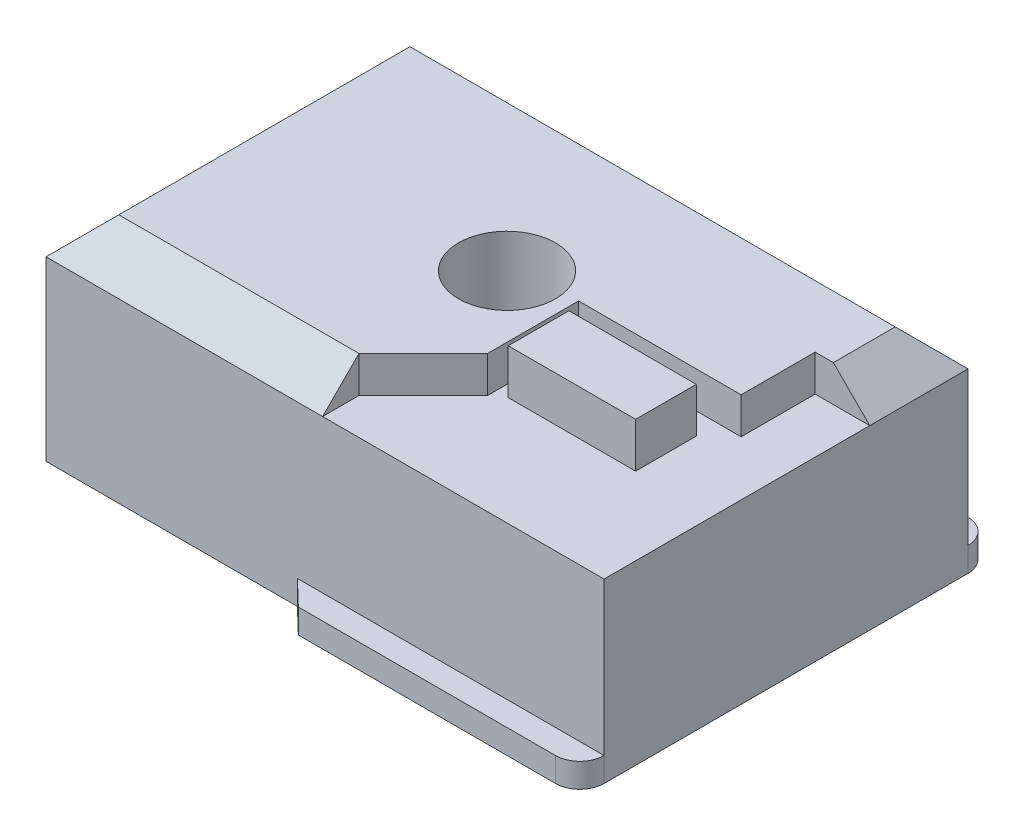
ISO-10303-21;
HEADER;
FILE_DESCRIPTION(('STEP AP214'),'2;1');
FILE_NAME('part.step','',(''),(''),'','','');
FILE_SCHEMA(('AUTOMOTIVE_DESIGN { 1 0 10303 214 1 1 1 1 }'));
ENDSEC;
DATA;
#1=APPLICATION_CONTEXT('core data for automotive mechanical design processes');
#2=APPLICATION_PROTOCOL_DEFINITION('international standard','automotive_design',2000,#1);
#3=PRODUCT_CONTEXT('',#1,'mechanical');
#4=PRODUCT('Part','Part','',(#3));
#5=PRODUCT_RELATED_PRODUCT_CATEGORY('part','',(#4));
#6=PRODUCT_DEFINITION_FORMATION('','',#4);
#7=PRODUCT_DEFINITION_CONTEXT('part definition',#1,'design');
#8=PRODUCT_DEFINITION('design','',#6,#7);
#9=PRODUCT_DEFINITION_SHAPE('','',#8);
#10=(LENGTH_UNIT() NAMED_UNIT(*) SI_UNIT(.MILLI.,.METRE.));
#11=(NAMED_UNIT(*) PLANE_ANGLE_UNIT() SI_UNIT($,.RADIAN.));
#12=(NAMED_UNIT(*) SI_UNIT($,.STERADIAN.) SOLID_ANGLE_UNIT());
#13=UNCERTAINTY_MEASURE_WITH_UNIT(LENGTH_MEASURE(1.E-05),#10,'distance_accuracy_value','');
#14=(GEOMETRIC_REPRESENTATION_CONTEXT(3) GLOBAL_UNCERTAINTY_ASSIGNED_CONTEXT((#13)) GLOBAL_UNIT_ASSIGNED_CONTEXT((#10,
#11,#12)) REPRESENTATION_CONTEXT('',''));
#15=CARTESIAN_POINT('',(0.,0.,0.));
#16=DIRECTION('',(0.,0.,1.));
#17=DIRECTION('',(1.,0.,0.));
#18=AXIS2_PLACEMENT_3D('',#15,#16,#17);
#19=CARTESIAN_POINT('',(0.,18.3,6.));
#20=DIRECTION('',(0.,0.,1.));
#21=DIRECTION('',(1.,0.,0.));
#22=AXIS2_PLACEMENT_3D('',#19,#20,#21);
#23=PLANE('',#22);
#24=DIRECTION('',(-1.,0.,0.));
#25=VECTOR('',#24,1.);
#26=CARTESIAN_POINT('',(0.,14.6,6.));
#27=LINE('',#26,#25);
#28=CARTESIAN_POINT('',(16.6,14.6,6.));
#29=VERTEX_POINT('',#28);
#30=CARTESIAN_POINT('',(6.1,14.6,6.));
#31=VERTEX_POINT('',#30);
#32=EDGE_CURVE('E112',#29,#31,#27,.T.);
#33=ORIENTED_EDGE('',*,*,#32,.F.);
#34=DIRECTION('',(0.,-1.,0.));
#35=VECTOR('',#34,1.);
#36=CARTESIAN_POINT('',(16.6,18.3,6.));
#37=LINE('',#36,#35);
#38=CARTESIAN_POINT('',(16.6,18.3,6.));
#39=VERTEX_POINT('',#38);
#40=EDGE_CURVE('E12',#39,#29,#37,.T.);
#41=ORIENTED_EDGE('',*,*,#40,.F.);
#42=DIRECTION('',(-1.,0.,0.));
#43=VECTOR('',#42,1.);
#44=CARTESIAN_POINT('',(0.,18.3,6.));
#45=LINE('',#44,#43);
#46=CARTESIAN_POINT('',(6.1,18.3,6.));
#47=VERTEX_POINT('',#46);
#48=EDGE_CURVE('E106',#39,#47,#45,.T.);
#49=ORIENTED_EDGE('',*,*,#48,.T.);
#50=DIRECTION('',(0.,-1.,0.));
#51=VECTOR('',#50,1.);
#52=CARTESIAN_POINT('',(6.1,18.3,6.));
#53=LINE('',#52,#51);
#54=EDGE_CURVE('E51',#47,#31,#53,.T.);
#55=ORIENTED_EDGE('',*,*,#54,.T.);
#56=EDGE_LOOP('',(#33,#41,#49,#55));
#57=FACE_BOUND('',#56,.T.);
#58=ADVANCED_FACE('F48',(#57),#23,.T.);
#59=CARTESIAN_POINT('',(16.6,18.3,0.));
#60=DIRECTION('',(1.,0.,0.));
#61=DIRECTION('',(0.,0.,-1.));
#62=AXIS2_PLACEMENT_3D('',#59,#60,#61);
#63=PLANE('',#62);
#64=DIRECTION('',(0.,0.,1.));
#65=VECTOR('',#64,1.);
#66=CARTESIAN_POINT('',(16.6,14.6,0.));
#67=LINE('',#66,#65);
#68=CARTESIAN_POINT('',(16.6,14.6,1.));
#69=VERTEX_POINT('',#68);
#70=EDGE_CURVE('E108',#69,#29,#67,.T.);
#71=ORIENTED_EDGE('',*,*,#70,.F.);
#72=DIRECTION('',(0.,-1.,0.));
#73=VECTOR('',#72,1.);
#74=CARTESIAN_POINT('',(16.6,18.3,1.));
#75=LINE('',#74,#73);
#76=CARTESIAN_POINT('',(16.6,18.3,1.));
#77=VERTEX_POINT('',#76);
#78=EDGE_CURVE('E57',#77,#69,#75,.T.);
#79=ORIENTED_EDGE('',*,*,#78,.F.);
#80=DIRECTION('',(0.,0.,1.));
#81=VECTOR('',#80,1.);
#82=CARTESIAN_POINT('',(16.6,18.3,0.));
#83=LINE('',#82,#81);
#84=EDGE_CURVE('E103',#77,#39,#83,.T.);
#85=ORIENTED_EDGE('',*,*,#84,.T.);
#86=ORIENTED_EDGE('',*,*,#40,.T.);
#87=EDGE_LOOP('',(#71,#79,#85,#86));
#88=FACE_BOUND('',#87,.T.);
#89=ADVANCED_FACE('F122',(#88),#63,.T.);
#90=CARTESIAN_POINT('',(0.,18.3,1.));
#91=DIRECTION('',(0.,0.,-1.));
#92=DIRECTION('',(-1.,0.,0.));
#93=AXIS2_PLACEMENT_3D('',#90,#91,#92);
#94=PLANE('',#93);
#95=DIRECTION('',(1.,0.,0.));
#96=VECTOR('',#95,1.);
#97=CARTESIAN_POINT('',(0.,14.6,1.));
#98=LINE('',#97,#96);
#99=CARTESIAN_POINT('',(6.1,14.6,1.));
#100=VERTEX_POINT('',#99);
#101=EDGE_CURVE('E98',#100,#69,#98,.T.);
#102=ORIENTED_EDGE('',*,*,#101,.F.);
#103=DIRECTION('',(0.,-1.,0.));
#104=VECTOR('',#103,1.);
#105=CARTESIAN_POINT('',(6.1,18.3,1.));
#106=LINE('',#105,#104);
#107=CARTESIAN_POINT('',(6.1,18.3,1.));
#108=VERTEX_POINT('',#107);
#109=EDGE_CURVE('E93',#108,#100,#106,.T.);
#110=ORIENTED_EDGE('',*,*,#109,.F.);
#111=DIRECTION('',(1.,0.,0.));
#112=VECTOR('',#111,1.);
#113=CARTESIAN_POINT('',(0.,18.3,1.));
#114=LINE('',#113,#112);
#115=EDGE_CURVE('E96',#108,#77,#114,.T.);
#116=ORIENTED_EDGE('',*,*,#115,.T.);
#117=ORIENTED_EDGE('',*,*,#78,.T.);
#118=EDGE_LOOP('',(#102,#110,#116,#117));
#119=FACE_BOUND('',#118,.T.);
#120=ADVANCED_FACE('F95',(#119),#94,.T.);
#121=CARTESIAN_POINT('',(6.1,18.3,0.));
#122=DIRECTION('',(-1.,0.,0.));
#123=DIRECTION('',(0.,0.,1.));
#124=AXIS2_PLACEMENT_3D('',#121,#122,#123);
#125=PLANE('',#124);
#126=DIRECTION('',(0.,0.,-1.));
#127=VECTOR('',#126,1.);
#128=CARTESIAN_POINT('',(6.1,14.6,0.));
#129=LINE('',#128,#127);
#130=EDGE_CURVE('E115',#31,#100,#129,.T.);
#131=ORIENTED_EDGE('',*,*,#130,.F.);
#132=ORIENTED_EDGE('',*,*,#54,.F.);
#133=DIRECTION('',(0.,0.,-1.));
#134=VECTOR('',#133,1.);
#135=CARTESIAN_POINT('',(6.1,18.3,0.));
#136=LINE('',#135,#134);
#137=EDGE_CURVE('E102',#47,#108,#136,.T.);
#138=ORIENTED_EDGE('',*,*,#137,.T.);
#139=ORIENTED_EDGE('',*,*,#109,.T.);
#140=EDGE_LOOP('',(#131,#132,#138,#139));
#141=FACE_BOUND('',#140,.T.);
#142=ADVANCED_FACE('F105',(#141),#125,.T.);
#143=CARTESIAN_POINT('',(0.,18.3,0.));
#144=DIRECTION('',(0.,-1.,0.));
#145=DIRECTION('',(0.,0.,-1.));
#146=AXIS2_PLACEMENT_3D('',#143,#144,#145);
#147=PLANE('',#146);
#148=ORIENTED_EDGE('',*,*,#48,.F.);
#149=ORIENTED_EDGE('',*,*,#84,.F.);
#150=ORIENTED_EDGE('',*,*,#115,.F.);
#151=ORIENTED_EDGE('',*,*,#137,.F.);
#152=EDGE_LOOP('',(#148,#149,#150,#151));
#153=FACE_BOUND('',#152,.T.);
#154=ADVANCED_FACE('F101',(#153),#147,.F.);
#155=CARTESIAN_POINT('',(0.,14.6,0.));
#156=DIRECTION('',(0.,-1.,0.));
#157=DIRECTION('',(0.,0.,-1.));
#158=AXIS2_PLACEMENT_3D('',#155,#156,#157);
#159=PLANE('',#158);
#160=ORIENTED_EDGE('',*,*,#32,.T.);
#161=ORIENTED_EDGE('',*,*,#130,.T.);
#162=ORIENTED_EDGE('',*,*,#101,.T.);
#163=ORIENTED_EDGE('',*,*,#70,.T.);
#164=EDGE_LOOP('',(#160,#161,#162,#163));
#165=FACE_BOUND('',#164,.T.);
#166=ADVANCED_FACE('F121',(#165),#159,.T.);
#167=CLOSED_SHELL('',(#58,#89,#120,#142,#154,#166));
#168=MANIFOLD_SOLID_BREP('B2',#167);
#169=CARTESIAN_POINT('',(0.,17.6000000000012,0.));
#170=DIRECTION('',(0.,1.00000000000005,0.));
#171=DIRECTION('',(0.,0.,1.00000000000005));
#172=AXIS2_PLACEMENT_3D('',#169,#170,#171);
#173=PLANE('',#172);
#174=CARTESIAN_POINT('',(0.,17.6000000000012,0.));
#175=DIRECTION('',(0.,1.00000000000005,0.));
#176=DIRECTION('',(0.,0.,1.00000000000005));
#177=AXIS2_PLACEMENT_3D('',#174,#175,#176);
#178=CIRCLE('',#177,4.);
#179=CARTESIAN_POINT('',(0.,17.6000000000012,4.0000000000002));
#180=VERTEX_POINT('',#179);
#181=EDGE_CURVE('E336',#180,#180,#178,.T.);
#182=ORIENTED_EDGE('',*,*,#181,.F.);
#183=EDGE_LOOP('',(#182));
#184=FACE_BOUND('',#183,.T.);
#185=DIRECTION('',(1.,0.,0.));
#186=VECTOR('',#185,1.);
#187=CARTESIAN_POINT('',(-20.,17.6000000000012,12.0000000000015));
#188=LINE('',#187,#186);
#189=CARTESIAN_POINT('',(-20.,17.6000000000012,12.0000000000015));
#190=VERTEX_POINT('',#189);
#191=CARTESIAN_POINT('',(-0.199999999999992,17.6000000000012,12.0000000000015));
#192=VERTEX_POINT('',#191);
#193=EDGE_CURVE('E348',#190,#192,#188,.T.);
#194=ORIENTED_EDGE('',*,*,#193,.T.);
#195=DIRECTION('',(0.707106781186546,0.,-0.707106781186574));
#196=VECTOR('',#195,1.);
#197=CARTESIAN_POINT('',(5.9,17.6000000000012,5.89999999999998));
#198=LINE('',#197,#196);
#199=CARTESIAN_POINT('',(5.1,17.6000000000012,6.69999999999998));
#200=VERTEX_POINT('',#199);
#201=EDGE_CURVE('E520',#192,#200,#198,.T.);
#202=ORIENTED_EDGE('',*,*,#201,.T.);
#203=DIRECTION('',(0.,0.,-1.00000000000005));
#204=VECTOR('',#203,1.);
#205=CARTESIAN_POINT('',(5.1,17.6000000000012,0.));
#206=LINE('',#205,#204);
#207=CARTESIAN_POINT('',(5.1,17.6000000000012,-0.800000000000002));
#208=VERTEX_POINT('',#207);
#209=EDGE_CURVE('E319',#200,#208,#206,.T.);
#210=ORIENTED_EDGE('',*,*,#209,.T.);
#211=DIRECTION('',(1.,0.,0.));
#212=VECTOR('',#211,1.);
#213=CARTESIAN_POINT('',(0.,17.6000000000012,-0.800000000000002));
#214=LINE('',#213,#212);
#215=CARTESIAN_POINT('',(18.5,17.6000000000012,-0.800000000000002));
#216=VERTEX_POINT('',#215);
#217=EDGE_CURVE('E508',#208,#216,#214,.T.);
#218=ORIENTED_EDGE('',*,*,#217,.T.);
#219=DIRECTION('',(0.,0.,-1.00000000000005));
#220=VECTOR('',#219,1.);
#221=CARTESIAN_POINT('',(18.5,17.6000000000012,0.));
#222=LINE('',#221,#220);
#223=CARTESIAN_POINT('',(18.5,17.6000000000012,-6.9));
#224=VERTEX_POINT('',#223);
#225=EDGE_CURVE('E506',#216,#224,#222,.T.);
#226=ORIENTED_EDGE('',*,*,#225,.T.);
#227=DIRECTION('',(1.,0.,0.));
#228=VECTOR('',#227,1.);
#229=CARTESIAN_POINT('',(0.,17.6000000000012,-6.9));
#230=LINE('',#229,#228);
#231=CARTESIAN_POINT('',(20.,17.6000000000012,-6.9));
#232=VERTEX_POINT('',#231);
#233=EDGE_CURVE('E315',#224,#232,#230,.T.);
#234=ORIENTED_EDGE('',*,*,#233,.T.);
#235=DIRECTION('',(0.,0.,-1.00000000000005));
#236=VECTOR('',#235,1.);
#237=CARTESIAN_POINT('',(20.,17.6000000000012,-12.0000000000004));
#238=LINE('',#237,#236);
#239=CARTESIAN_POINT('',(20.,17.6000000000012,-12.0000000000004));
#240=VERTEX_POINT('',#239);
#241=EDGE_CURVE('E339',#232,#240,#238,.T.);
#242=ORIENTED_EDGE('',*,*,#241,.T.);
#243=DIRECTION('',(-1.,0.,0.));
#244=VECTOR('',#243,1.);
#245=CARTESIAN_POINT('',(-20.,17.6000000000012,-12.0000000000004));
#246=LINE('',#245,#244);
#247=CARTESIAN_POINT('',(-20.,17.6000000000012,-12.0000000000004));
#248=VERTEX_POINT('',#247);
#249=EDGE_CURVE('E343',#240,#248,#246,.T.);
#250=ORIENTED_EDGE('',*,*,#249,.T.);
#251=DIRECTION('',(0.,0.,1.00000000000005));
#252=VECTOR('',#251,1.);
#253=CARTESIAN_POINT('',(-20.,17.6000000000012,-12.0000000000004));
#254=LINE('',#253,#252);
#255=EDGE_CURVE('E346',#248,#190,#254,.T.);
#256=ORIENTED_EDGE('',*,*,#255,.T.);
#257=EDGE_LOOP('',(#194,#202,#210,#218,#226,#234,#242,#250,#256));
#258=FACE_BOUND('',#257,.T.);
#259=ADVANCED_FACE('F171',(#184,#258),#173,.T.);
#260=CARTESIAN_POINT('',(0.,37.6000000000023,-16.2426406871201));
#261=DIRECTION('',(0.707106781186548,0.707106781186572,0.));
#262=DIRECTION('',(-0.707106781186547,0.707106781186572,0.));
#263=AXIS2_PLACEMENT_3D('',#260,#261,#262);
#264=PLANE('',#263);
#265=ORIENTED_EDGE('',*,*,#241,.F.);
#266=DIRECTION('',(0.707106781186547,-0.707106781186572,0.));
#267=VECTOR('',#266,1.);
#268=CARTESIAN_POINT('',(0.,37.6000000000023,-6.9));
#269=LINE('',#268,#267);
#270=CARTESIAN_POINT('',(23.,14.6000000000015,-6.9));
#271=VERTEX_POINT('',#270);
#272=EDGE_CURVE('E46',#232,#271,#269,.T.);
#273=ORIENTED_EDGE('',*,*,#272,.T.);
#274=DIRECTION('',(0.,0.,-1.00000000000005));
#275=VECTOR('',#274,1.);
#276=CARTESIAN_POINT('',(23.,14.6000000000015,15.0000000000015));
#277=LINE('',#276,#275);
#278=CARTESIAN_POINT('',(23.,14.6000000000015,-15.0000000000008));
#279=VERTEX_POINT('',#278);
#280=EDGE_CURVE('E357',#271,#279,#277,.T.);
#281=ORIENTED_EDGE('',*,*,#280,.T.);
#282=DIRECTION('',(0.577350269189626,-0.577350269189651,-0.577350269189651));
#283=VECTOR('',#282,1.);
#284=CARTESIAN_POINT('',(8.08088022903977,29.5191197709622,-0.0808802290397717));
#285=LINE('',#284,#283);
#286=EDGE_CURVE('E324',#240,#279,#285,.T.);
#287=ORIENTED_EDGE('',*,*,#286,.F.);
#288=EDGE_LOOP('',(#265,#273,#281,#287));
#289=FACE_BOUND('',#288,.T.);
#290=ADVANCED_FACE('F496',(#289),#264,.T.);
#291=CARTESIAN_POINT('',(-52.0198577212881,40.3475468957087,-10.7475468957065));
#292=DIRECTION('',(0.,-0.707106781186573,-0.707106781186571));
#293=DIRECTION('',(0.,0.707106781186571,-0.707106781186573));
#294=AXIS2_PLACEMENT_3D('',#291,#292,#293);
#295=PLANE('',#294);
#296=DIRECTION('',(0.,-0.707106781186571,0.707106781186573));
#297=VECTOR('',#296,1.);
#298=CARTESIAN_POINT('',(-0.199999999999992,40.3475468957087,-10.7475468957065));
#299=LINE('',#298,#297);
#300=CARTESIAN_POINT('',(-0.199999999999992,14.6000000000015,15.0000000000015));
#301=VERTEX_POINT('',#300);
#302=EDGE_CURVE('E179',#192,#301,#299,.T.);
#303=ORIENTED_EDGE('',*,*,#302,.F.);
#304=ORIENTED_EDGE('',*,*,#193,.F.);
#305=DIRECTION('',(0.577350269189625,0.57735026918965,-0.577350269189652));
#306=VECTOR('',#305,1.);
#307=CARTESIAN_POINT('',(-15.5082546432917,22.0917453567094,7.50825464329169));
#308=LINE('',#307,#306);
#309=CARTESIAN_POINT('',(-23.,14.6000000000015,15.0000000000015));
#310=VERTEX_POINT('',#309);
#311=EDGE_CURVE('E320',#310,#190,#308,.T.);
#312=ORIENTED_EDGE('',*,*,#311,.F.);
#313=DIRECTION('',(1.,0.,0.));
#314=VECTOR('',#313,1.);
#315=CARTESIAN_POINT('',(-23.,14.6000000000015,15.0000000000015));
#316=LINE('',#315,#314);
#317=EDGE_CURVE('E354',#310,#301,#316,.T.);
#318=ORIENTED_EDGE('',*,*,#317,.T.);
#319=EDGE_LOOP('',(#303,#304,#312,#318));
#320=FACE_BOUND('',#319,.T.);
#321=ADVANCED_FACE('F450',(#320),#295,.F.);
#322=CARTESIAN_POINT('',(-21.,2.00000000000077,-15.0000000000008));
#323=DIRECTION('',(0.,1.00000000000005,0.));
#324=DIRECTION('',(0.,0.,1.00000000000005));
#325=AXIS2_PLACEMENT_3D('',#322,#323,#324);
#326=PLANE('',#325);
#327=CARTESIAN_POINT('',(21.,2.00000000000077,15.0000000000015));
#328=DIRECTION('',(0.,1.00000000000005,0.));
#329=DIRECTION('',(0.,0.,1.00000000000005));
#330=AXIS2_PLACEMENT_3D('',#327,#328,#329);
#331=CIRCLE('',#330,2.);
#332=CARTESIAN_POINT('',(21.,2.00000000000077,17.0000000000015));
#333=VERTEX_POINT('',#332);
#334=CARTESIAN_POINT('',(23.,2.00000000000077,15.0000000000015));
#335=VERTEX_POINT('',#334);
#336=EDGE_CURVE('E392',#333,#335,#331,.T.);
#337=ORIENTED_EDGE('',*,*,#336,.T.);
#338=DIRECTION('',(-1.,0.,0.));
#339=VECTOR('',#338,1.);
#340=CARTESIAN_POINT('',(-21.,2.00000000000077,15.0000000000015));
#341=LINE('',#340,#339);
#342=CARTESIAN_POINT('',(-2.27407407407407,2.00000000000077,15.0000000000015));
#343=VERTEX_POINT('',#342);
#344=EDGE_CURVE('E381',#335,#343,#341,.T.);
#345=ORIENTED_EDGE('',*,*,#344,.T.);
#346=DIRECTION('',(0.719844295420686,0.,0.694135570584256));
#347=VECTOR('',#346,1.);
#348=CARTESIAN_POINT('',(-3.,2.00000000000077,14.3000000000015));
#349=LINE('',#348,#347);
#350=CARTESIAN_POINT('',(-0.199999999999999,2.00000000000077,17.0000000000015));
#351=VERTEX_POINT('',#350);
#352=EDGE_CURVE('E387',#343,#351,#349,.T.);
#353=ORIENTED_EDGE('',*,*,#352,.T.);
#354=DIRECTION('',(1.,0.,0.));
#355=VECTOR('',#354,1.);
#356=CARTESIAN_POINT('',(21.,2.00000000000077,17.0000000000015));
#357=LINE('',#356,#355);
#358=EDGE_CURVE('E390',#351,#333,#357,.T.);
#359=ORIENTED_EDGE('',*,*,#358,.T.);
#360=EDGE_LOOP('',(#337,#345,#353,#359));
#361=FACE_BOUND('',#360,.T.);
#362=ADVANCED_FACE('F552',(#361),#326,.T.);
#363=CARTESIAN_POINT('',(-21.,2.00000000000077,-15.0000000000008));
#364=DIRECTION('',(0.,1.00000000000005,0.));
#365=DIRECTION('',(0.,0.,1.00000000000005));
#366=AXIS2_PLACEMENT_3D('',#363,#364,#365);
#367=CIRCLE('',#366,2.);
#368=CARTESIAN_POINT('',(-21.,2.00000000000077,-17.0000000000008));
#369=VERTEX_POINT('',#368);
#370=CARTESIAN_POINT('',(-23.,2.00000000000077,-15.0000000000008));
#371=VERTEX_POINT('',#370);
#372=EDGE_CURVE('E385',#369,#371,#367,.T.);
#373=ORIENTED_EDGE('',*,*,#372,.T.);
#374=DIRECTION('',(1.,0.,0.));
#375=VECTOR('',#374,1.);
#376=CARTESIAN_POINT('',(-21.,2.00000000000077,-15.0000000000008));
#377=LINE('',#376,#375);
#378=CARTESIAN_POINT('',(23.,2.00000000000077,-15.0000000000008));
#379=VERTEX_POINT('',#378);
#380=EDGE_CURVE('E378',#371,#379,#377,.T.);
#381=ORIENTED_EDGE('',*,*,#380,.T.);
#382=CARTESIAN_POINT('',(21.,2.00000000000077,-15.0000000000008));
#383=DIRECTION('',(0.,1.00000000000005,0.));
#384=DIRECTION('',(0.,0.,1.00000000000005));
#385=AXIS2_PLACEMENT_3D('',#382,#383,#384);
#386=CIRCLE('',#385,2.);
#387=CARTESIAN_POINT('',(21.,2.00000000000077,-17.0000000000008));
#388=VERTEX_POINT('',#387);
#389=EDGE_CURVE('E394',#379,#388,#386,.T.);
#390=ORIENTED_EDGE('',*,*,#389,.T.);
#391=DIRECTION('',(-1.,0.,0.));
#392=VECTOR('',#391,1.);
#393=CARTESIAN_POINT('',(-21.,2.00000000000077,-17.0000000000008));
#394=LINE('',#393,#392);
#395=EDGE_CURVE('E396',#388,#369,#394,.T.);
#396=ORIENTED_EDGE('',*,*,#395,.T.);
#397=EDGE_LOOP('',(#373,#381,#390,#396));
#398=FACE_BOUND('',#397,.T.);
#399=ADVANCED_FACE('F468',(#398),#326,.T.);
#400=CARTESIAN_POINT('',(-3.,2.00000000000077,14.3000000000015));
#401=DIRECTION('',(0.694135570584232,0.,-0.71984429542071));
#402=DIRECTION('',(-0.719844295420686,0.,-0.694135570584256));
#403=AXIS2_PLACEMENT_3D('',#400,#401,#402);
#404=PLANE('',#403);
#405=DIRECTION('',(0.,1.00000000000005,0.));
#406=VECTOR('',#405,1.);
#407=CARTESIAN_POINT('',(-2.27407407407407,2.00000000000077,15.0000000000015));
#408=LINE('',#407,#406);
#409=CARTESIAN_POINT('',(-2.27407407407407,0.,15.0000000000015));
#410=VERTEX_POINT('',#409);
#411=EDGE_CURVE('E194',#410,#343,#408,.T.);
#412=ORIENTED_EDGE('',*,*,#411,.F.);
#413=DIRECTION('',(0.719844295420686,0.,0.694135570584256));
#414=VECTOR('',#413,1.);
#415=CARTESIAN_POINT('',(-3.,0.,14.3000000000015));
#416=LINE('',#415,#414);
#417=CARTESIAN_POINT('',(-0.199999999999999,0.,17.0000000000015));
#418=VERTEX_POINT('',#417);
#419=EDGE_CURVE('E403',#410,#418,#416,.T.);
#420=ORIENTED_EDGE('',*,*,#419,.T.);
#421=DIRECTION('',(0.,-1.00000000000005,0.));
#422=VECTOR('',#421,1.);
#423=CARTESIAN_POINT('',(-0.199999999999999,2.00000000000077,17.0000000000015));
#424=LINE('',#423,#422);
#425=EDGE_CURVE('E428',#351,#418,#424,.T.);
#426=ORIENTED_EDGE('',*,*,#425,.F.);
#427=ORIENTED_EDGE('',*,*,#352,.F.);
#428=EDGE_LOOP('',(#412,#420,#426,#427));
#429=FACE_BOUND('',#428,.T.);
#430=ADVANCED_FACE('F557',(#429),#404,.F.);
#431=CARTESIAN_POINT('',(-21.,0.,-15.0000000000008));
#432=DIRECTION('',(0.,1.00000000000005,0.));
#433=DIRECTION('',(0.,0.,1.00000000000005));
#434=AXIS2_PLACEMENT_3D('',#431,#432,#433);
#435=PLANE('',#434);
#436=CARTESIAN_POINT('',(0.,0.,0.));
#437=DIRECTION('',(0.,1.00000000000005,0.));
#438=DIRECTION('',(0.,0.,1.00000000000005));
#439=AXIS2_PLACEMENT_3D('',#436,#437,#438);
#440=CIRCLE('',#439,4.);
#441=CARTESIAN_POINT('',(0.,0.,4.0000000000002));
#442=VERTEX_POINT('',#441);
#443=EDGE_CURVE('E335',#442,#442,#440,.T.);
#444=ORIENTED_EDGE('',*,*,#443,.T.);
#445=EDGE_LOOP('',(#444));
#446=FACE_BOUND('',#445,.T.);
#447=DIRECTION('',(0.,0.,-1.00000000000005));
#448=VECTOR('',#447,1.);
#449=CARTESIAN_POINT('',(23.,0.,-15.0000000000008));
#450=LINE('',#449,#448);
#451=CARTESIAN_POINT('',(23.,0.,15.0000000000015));
#452=VERTEX_POINT('',#451);
#453=CARTESIAN_POINT('',(23.,0.,-15.0000000000008));
#454=VERTEX_POINT('',#453);
#455=EDGE_CURVE('E409',#452,#454,#450,.T.);
#456=ORIENTED_EDGE('',*,*,#455,.F.);
#457=CARTESIAN_POINT('',(21.,0.,15.0000000000015));
#458=DIRECTION('',(0.,1.00000000000005,0.));
#459=DIRECTION('',(0.,0.,1.00000000000005));
#460=AXIS2_PLACEMENT_3D('',#457,#458,#459);
#461=CIRCLE('',#460,2.);
#462=CARTESIAN_POINT('',(21.,0.,17.0000000000015));
#463=VERTEX_POINT('',#462);
#464=EDGE_CURVE('E407',#463,#452,#461,.T.);
#465=ORIENTED_EDGE('',*,*,#464,.F.);
#466=DIRECTION('',(1.,0.,0.));
#467=VECTOR('',#466,1.);
#468=CARTESIAN_POINT('',(21.,0.,17.0000000000015));
#469=LINE('',#468,#467);
#470=EDGE_CURVE('E405',#418,#463,#469,.T.);
#471=ORIENTED_EDGE('',*,*,#470,.F.);
#472=ORIENTED_EDGE('',*,*,#419,.F.);
#473=DIRECTION('',(1.,0.,0.));
#474=VECTOR('',#473,1.);
#475=CARTESIAN_POINT('',(-23.,0.,15.0000000000015));
#476=LINE('',#475,#474);
#477=CARTESIAN_POINT('',(-23.,0.,15.0000000000015));
#478=VERTEX_POINT('',#477);
#479=EDGE_CURVE('E351',#478,#410,#476,.T.);
#480=ORIENTED_EDGE('',*,*,#479,.F.);
#481=DIRECTION('',(0.,0.,1.00000000000005));
#482=VECTOR('',#481,1.);
#483=CARTESIAN_POINT('',(-23.,0.,-15.0000000000008));
#484=LINE('',#483,#482);
#485=CARTESIAN_POINT('',(-23.,0.,-15.0000000000008));
#486=VERTEX_POINT('',#485);
#487=EDGE_CURVE('E401',#486,#478,#484,.T.);
#488=ORIENTED_EDGE('',*,*,#487,.F.);
#489=CARTESIAN_POINT('',(-21.,0.,-15.0000000000008));
#490=DIRECTION('',(0.,1.00000000000005,0.));
#491=DIRECTION('',(0.,0.,1.00000000000005));
#492=AXIS2_PLACEMENT_3D('',#489,#490,#491);
#493=CIRCLE('',#492,2.);
#494=CARTESIAN_POINT('',(-21.,0.,-17.0000000000008));
#495=VERTEX_POINT('',#494);
#496=EDGE_CURVE('E384',#495,#486,#493,.T.);
#497=ORIENTED_EDGE('',*,*,#496,.F.);
#498=DIRECTION('',(-1.,0.,0.));
#499=VECTOR('',#498,1.);
#500=CARTESIAN_POINT('',(-21.,0.,-17.0000000000008));
#501=LINE('',#500,#499);
#502=CARTESIAN_POINT('',(21.,0.,-17.0000000000008));
#503=VERTEX_POINT('',#502);
#504=EDGE_CURVE('E388',#503,#495,#501,.T.);
#505=ORIENTED_EDGE('',*,*,#504,.F.);
#506=CARTESIAN_POINT('',(21.,0.,-15.0000000000008));
#507=DIRECTION('',(0.,1.00000000000005,0.));
#508=DIRECTION('',(0.,0.,1.00000000000005));
#509=AXIS2_PLACEMENT_3D('',#506,#507,#508);
#510=CIRCLE('',#509,2.);
#511=EDGE_CURVE('E411',#454,#503,#510,.T.);
#512=ORIENTED_EDGE('',*,*,#511,.F.);
#513=EDGE_LOOP('',(#456,#465,#471,#472,#480,#488,#497,#505,#512));
#514=FACE_BOUND('',#513,.T.);
#515=ADVANCED_FACE('F489',(#446,#514),#435,.F.);
#516=CARTESIAN_POINT('',(-21.,2.00000000000077,-15.0000000000008));
#517=DIRECTION('',(0.,-1.00000000000005,0.));
#518=DIRECTION('',(0.,0.,-1.00000000000005));
#519=AXIS2_PLACEMENT_3D('',#516,#517,#518);
#520=CYLINDRICAL_SURFACE('',#519,2.);
#521=ORIENTED_EDGE('',*,*,#496,.T.);
#522=DIRECTION('',(0.,-1.00000000000005,0.));
#523=VECTOR('',#522,1.);
#524=CARTESIAN_POINT('',(-23.,2.00000000000077,-15.0000000000008));
#525=LINE('',#524,#523);
#526=EDGE_CURVE('E431',#371,#486,#525,.T.);
#527=ORIENTED_EDGE('',*,*,#526,.F.);
#528=ORIENTED_EDGE('',*,*,#372,.F.);
#529=DIRECTION('',(0.,-1.00000000000005,0.));
#530=VECTOR('',#529,1.);
#531=CARTESIAN_POINT('',(-21.,2.00000000000077,-17.0000000000008));
#532=LINE('',#531,#530);
#533=EDGE_CURVE('E398',#369,#495,#532,.T.);
#534=ORIENTED_EDGE('',*,*,#533,.T.);
#535=EDGE_LOOP('',(#521,#527,#528,#534));
#536=FACE_BOUND('',#535,.T.);
#537=ADVANCED_FACE('F173',(#536),#520,.T.);
#538=CARTESIAN_POINT('',(-23.,2.00000000000077,-15.0000000000008));
#539=DIRECTION('',(1.,0.,0.));
#540=DIRECTION('',(0.,0.,-1.00000000000005));
#541=AXIS2_PLACEMENT_3D('',#538,#539,#540);
#542=PLANE('',#541);
#543=ORIENTED_EDGE('',*,*,#487,.T.);
#544=DIRECTION('',(0.,-1.00000000000005,0.));
#545=VECTOR('',#544,1.);
#546=CARTESIAN_POINT('',(-23.,14.6000000000015,15.0000000000015));
#547=LINE('',#546,#545);
#548=EDGE_CURVE('E375',#310,#478,#547,.T.);
#549=ORIENTED_EDGE('',*,*,#548,.F.);
#550=DIRECTION('',(0.,0.,1.00000000000005));
#551=VECTOR('',#550,1.);
#552=CARTESIAN_POINT('',(-23.,14.6000000000015,15.0000000000015));
#553=LINE('',#552,#551);
#554=CARTESIAN_POINT('',(-23.,14.6000000000015,-15.0000000000008));
#555=VERTEX_POINT('',#554);
#556=EDGE_CURVE('E352',#555,#310,#553,.T.);
#557=ORIENTED_EDGE('',*,*,#556,.F.);
#558=DIRECTION('',(0.,-1.00000000000005,0.));
#559=VECTOR('',#558,1.);
#560=CARTESIAN_POINT('',(-23.,14.6000000000015,-15.0000000000008));
#561=LINE('',#560,#559);
#562=EDGE_CURVE('E364',#555,#371,#561,.T.);
#563=ORIENTED_EDGE('',*,*,#562,.T.);
#564=ORIENTED_EDGE('',*,*,#526,.T.);
#565=EDGE_LOOP('',(#543,#549,#557,#563,#564));
#566=FACE_BOUND('',#565,.T.);
#567=ADVANCED_FACE('F456',(#566),#542,.F.);
#568=CARTESIAN_POINT('',(21.,2.00000000000077,17.0000000000015));
#569=DIRECTION('',(0.,0.,-1.00000000000005));
#570=DIRECTION('',(-1.,0.,0.));
#571=AXIS2_PLACEMENT_3D('',#568,#569,#570);
#572=PLANE('',#571);
#573=ORIENTED_EDGE('',*,*,#470,.T.);
#574=DIRECTION('',(0.,-1.00000000000005,0.));
#575=VECTOR('',#574,1.);
#576=CARTESIAN_POINT('',(21.,2.00000000000077,17.0000000000015));
#577=LINE('',#576,#575);
#578=EDGE_CURVE('E425',#333,#463,#577,.T.);
#579=ORIENTED_EDGE('',*,*,#578,.F.);
#580=ORIENTED_EDGE('',*,*,#358,.F.);
#581=ORIENTED_EDGE('',*,*,#425,.T.);
#582=EDGE_LOOP('',(#573,#579,#580,#581));
#583=FACE_BOUND('',#582,.T.);
#584=ADVANCED_FACE('F568',(#583),#572,.F.);
#585=CARTESIAN_POINT('',(21.,2.00000000000077,15.0000000000015));
#586=DIRECTION('',(0.,-1.00000000000005,0.));
#587=DIRECTION('',(0.,0.,-1.00000000000005));
#588=AXIS2_PLACEMENT_3D('',#585,#586,#587);
#589=CYLINDRICAL_SURFACE('',#588,2.);
#590=ORIENTED_EDGE('',*,*,#464,.T.);
#591=DIRECTION('',(0.,-1.00000000000005,0.));
#592=VECTOR('',#591,1.);
#593=CARTESIAN_POINT('',(23.,2.00000000000077,15.0000000000015));
#594=LINE('',#593,#592);
#595=EDGE_CURVE('E422',#335,#452,#594,.T.);
#596=ORIENTED_EDGE('',*,*,#595,.F.);
#597=ORIENTED_EDGE('',*,*,#336,.F.);
#598=ORIENTED_EDGE('',*,*,#578,.T.);
#599=EDGE_LOOP('',(#590,#596,#597,#598));
#600=FACE_BOUND('',#599,.T.);
#601=ADVANCED_FACE('F565',(#600),#589,.T.);
#602=CARTESIAN_POINT('',(23.,2.00000000000077,-15.0000000000008));
#603=DIRECTION('',(-1.,0.,0.));
#604=DIRECTION('',(0.,0.,1.00000000000005));
#605=AXIS2_PLACEMENT_3D('',#602,#603,#604);
#606=PLANE('',#605);
#607=ORIENTED_EDGE('',*,*,#455,.T.);
#608=DIRECTION('',(0.,-1.00000000000005,0.));
#609=VECTOR('',#608,1.);
#610=CARTESIAN_POINT('',(23.,2.00000000000077,-15.0000000000008));
#611=LINE('',#610,#609);
#612=EDGE_CURVE('E419',#379,#454,#611,.T.);
#613=ORIENTED_EDGE('',*,*,#612,.F.);
#614=DIRECTION('',(0.,-1.00000000000005,0.));
#615=VECTOR('',#614,1.);
#616=CARTESIAN_POINT('',(23.,14.6000000000015,-15.0000000000008));
#617=LINE('',#616,#615);
#618=EDGE_CURVE('E369',#279,#379,#617,.T.);
#619=ORIENTED_EDGE('',*,*,#618,.F.);
#620=ORIENTED_EDGE('',*,*,#280,.F.);
#621=CARTESIAN_POINT('',(23.,14.6000000000015,15.0000000000015));
#622=VERTEX_POINT('',#621);
#623=EDGE_CURVE('E358',#622,#271,#277,.T.);
#624=ORIENTED_EDGE('',*,*,#623,.F.);
#625=DIRECTION('',(0.,-1.00000000000005,0.));
#626=VECTOR('',#625,1.);
#627=CARTESIAN_POINT('',(23.,14.6000000000015,15.0000000000015));
#628=LINE('',#627,#626);
#629=EDGE_CURVE('E372',#622,#335,#628,.T.);
#630=ORIENTED_EDGE('',*,*,#629,.T.);
#631=ORIENTED_EDGE('',*,*,#595,.T.);
#632=EDGE_LOOP('',(#607,#613,#619,#620,#624,#630,#631));
#633=FACE_BOUND('',#632,.T.);
#634=ADVANCED_FACE('F474',(#633),#606,.F.);
#635=CARTESIAN_POINT('',(21.,2.00000000000077,-15.0000000000008));
#636=DIRECTION('',(0.,-1.00000000000005,0.));
#637=DIRECTION('',(0.,0.,-1.00000000000005));
#638=AXIS2_PLACEMENT_3D('',#635,#636,#637);
#639=CYLINDRICAL_SURFACE('',#638,2.);
#640=ORIENTED_EDGE('',*,*,#511,.T.);
#641=DIRECTION('',(0.,-1.00000000000005,0.));
#642=VECTOR('',#641,1.);
#643=CARTESIAN_POINT('',(21.,2.00000000000077,-17.0000000000008));
#644=LINE('',#643,#642);
#645=EDGE_CURVE('E416',#388,#503,#644,.T.);
#646=ORIENTED_EDGE('',*,*,#645,.F.);
#647=ORIENTED_EDGE('',*,*,#389,.F.);
#648=ORIENTED_EDGE('',*,*,#612,.T.);
#649=EDGE_LOOP('',(#640,#646,#647,#648));
#650=FACE_BOUND('',#649,.T.);
#651=ADVANCED_FACE('F479',(#650),#639,.T.);
#652=CARTESIAN_POINT('',(-21.,2.00000000000077,-17.0000000000008));
#653=DIRECTION('',(0.,0.,1.00000000000005));
#654=DIRECTION('',(1.,0.,0.));
#655=AXIS2_PLACEMENT_3D('',#652,#653,#654);
#656=PLANE('',#655);
#657=ORIENTED_EDGE('',*,*,#504,.T.);
#658=ORIENTED_EDGE('',*,*,#533,.F.);
#659=ORIENTED_EDGE('',*,*,#395,.F.);
#660=ORIENTED_EDGE('',*,*,#645,.T.);
#661=EDGE_LOOP('',(#657,#658,#659,#660));
#662=FACE_BOUND('',#661,.T.);
#663=ADVANCED_FACE('F484',(#662),#656,.F.);
#664=CARTESIAN_POINT('',(-23.,14.6000000000015,15.0000000000015));
#665=DIRECTION('',(0.,0.,-1.00000000000005));
#666=DIRECTION('',(-1.,0.,0.));
#667=AXIS2_PLACEMENT_3D('',#664,#665,#666);
#668=PLANE('',#667);
#669=ORIENTED_EDGE('',*,*,#344,.F.);
#670=ORIENTED_EDGE('',*,*,#629,.F.);
#671=DIRECTION('',(-1.,0.,0.));
#672=VECTOR('',#671,1.);
#673=CARTESIAN_POINT('',(0.,14.6000000000015,15.0000000000015));
#674=LINE('',#673,#672);
#675=EDGE_CURVE('E442',#622,#301,#674,.T.);
#676=ORIENTED_EDGE('',*,*,#675,.T.);
#677=ORIENTED_EDGE('',*,*,#317,.F.);
#678=ORIENTED_EDGE('',*,*,#548,.T.);
#679=ORIENTED_EDGE('',*,*,#479,.T.);
#680=ORIENTED_EDGE('',*,*,#411,.T.);
#681=EDGE_LOOP('',(#669,#670,#676,#677,#678,#679,#680));
#682=FACE_BOUND('',#681,.T.);
#683=ADVANCED_FACE('F444',(#682),#668,.F.);
#684=CARTESIAN_POINT('',(-23.,14.6000000000015,-15.0000000000008));
#685=DIRECTION('',(0.,0.,1.00000000000005));
#686=DIRECTION('',(1.,0.,0.));
#687=AXIS2_PLACEMENT_3D('',#684,#685,#686);
#688=PLANE('',#687);
#689=ORIENTED_EDGE('',*,*,#380,.F.);
#690=ORIENTED_EDGE('',*,*,#562,.F.);
#691=DIRECTION('',(-1.,0.,0.));
#692=VECTOR('',#691,1.);
#693=CARTESIAN_POINT('',(-23.,14.6000000000015,-15.0000000000008));
#694=LINE('',#693,#692);
#695=EDGE_CURVE('E361',#279,#555,#694,.T.);
#696=ORIENTED_EDGE('',*,*,#695,.F.);
#697=ORIENTED_EDGE('',*,*,#618,.T.);
#698=EDGE_LOOP('',(#689,#690,#696,#697));
#699=FACE_BOUND('',#698,.T.);
#700=ADVANCED_FACE('F464',(#699),#688,.F.);
#701=CARTESIAN_POINT('',(0.,17.6000000000012,0.));
#702=DIRECTION('',(0.,-1.00000000000005,0.));
#703=DIRECTION('',(0.,0.,-1.00000000000005));
#704=AXIS2_PLACEMENT_3D('',#701,#702,#703);
#705=CYLINDRICAL_SURFACE('',#704,4.);
#706=ORIENTED_EDGE('',*,*,#181,.T.);
#707=EDGE_LOOP('',(#706));
#708=FACE_BOUND('',#707,.T.);
#709=ORIENTED_EDGE('',*,*,#443,.F.);
#710=EDGE_LOOP('',(#709));
#711=FACE_BOUND('',#710,.T.);
#712=ADVANCED_FACE('F546',(#708,#711),#705,.F.);
#713=CARTESIAN_POINT('',(-20.,17.6000000000012,-16.2426406871201));
#714=DIRECTION('',(-0.707106781186548,0.707106781186572,0.));
#715=DIRECTION('',(-0.707106781186547,-0.707106781186573,0.));
#716=AXIS2_PLACEMENT_3D('',#713,#714,#715);
#717=PLANE('',#716);
#718=ORIENTED_EDGE('',*,*,#255,.F.);
#719=DIRECTION('',(-0.577350269189625,-0.577350269189651,-0.577350269189651));
#720=VECTOR('',#719,1.);
#721=CARTESIAN_POINT('',(-19.1177303515405,18.4822696484607,-11.1177303515405));
#722=LINE('',#721,#720);
#723=EDGE_CURVE('E332',#248,#555,#722,.T.);
#724=ORIENTED_EDGE('',*,*,#723,.T.);
#725=ORIENTED_EDGE('',*,*,#556,.T.);
#726=ORIENTED_EDGE('',*,*,#311,.T.);
#727=EDGE_LOOP('',(#718,#724,#725,#726));
#728=FACE_BOUND('',#727,.T.);
#729=ADVANCED_FACE('F452',(#728),#717,.T.);
#730=CARTESIAN_POINT('',(-41.1914305965419,29.5191197709622,-0.0808802290397717));
#731=DIRECTION('',(0.,-0.707106781186572,0.707106781186572));
#732=DIRECTION('',(0.,-0.707106781186572,-0.707106781186572));
#733=AXIS2_PLACEMENT_3D('',#730,#731,#732);
#734=PLANE('',#733);
#735=ORIENTED_EDGE('',*,*,#723,.F.);
#736=ORIENTED_EDGE('',*,*,#249,.F.);
#737=ORIENTED_EDGE('',*,*,#286,.T.);
#738=ORIENTED_EDGE('',*,*,#695,.T.);
#739=EDGE_LOOP('',(#735,#736,#737,#738));
#740=FACE_BOUND('',#739,.T.);
#741=ADVANCED_FACE('F459',(#740),#734,.F.);
#742=CARTESIAN_POINT('',(-0.199999999999992,14.6000000000015,0.));
#743=DIRECTION('',(1.,0.,0.));
#744=DIRECTION('',(0.,0.,-1.00000000000005));
#745=AXIS2_PLACEMENT_3D('',#742,#743,#744);
#746=PLANE('',#745);
#747=ORIENTED_EDGE('',*,*,#302,.T.);
#748=DIRECTION('',(0.,0.,-1.00000000000005));
#749=VECTOR('',#748,1.);
#750=CARTESIAN_POINT('',(-0.199999999999992,14.6000000000015,0.));
#751=LINE('',#750,#749);
#752=CARTESIAN_POINT('',(-0.199999999999992,14.6000000000015,12.0000000000015));
#753=VERTEX_POINT('',#752);
#754=EDGE_CURVE('E186',#301,#753,#751,.T.);
#755=ORIENTED_EDGE('',*,*,#754,.T.);
#756=DIRECTION('',(0.,1.00000000000005,0.));
#757=VECTOR('',#756,1.);
#758=CARTESIAN_POINT('',(-0.199999999999992,14.6000000000015,12.0000000000015));
#759=LINE('',#758,#757);
#760=EDGE_CURVE('E314',#753,#192,#759,.T.);
#761=ORIENTED_EDGE('',*,*,#760,.T.);
#762=EDGE_LOOP('',(#747,#755,#761));
#763=FACE_BOUND('',#762,.T.);
#764=ADVANCED_FACE('F436',(#763),#746,.T.);
#765=CARTESIAN_POINT('',(5.9,14.6000000000015,5.89999999999998));
#766=DIRECTION('',(0.707106781186549,0.,0.707106781186571));
#767=DIRECTION('',(0.707106781186546,0.,-0.707106781186574));
#768=AXIS2_PLACEMENT_3D('',#765,#766,#767);
#769=PLANE('',#768);
#770=ORIENTED_EDGE('',*,*,#201,.F.);
#771=ORIENTED_EDGE('',*,*,#760,.F.);
#772=DIRECTION('',(0.707106781186546,0.,-0.707106781186574));
#773=VECTOR('',#772,1.);
#774=CARTESIAN_POINT('',(5.9,14.6000000000015,5.89999999999998));
#775=LINE('',#774,#773);
#776=CARTESIAN_POINT('',(5.1,14.6000000000015,6.69999999999998));
#777=VERTEX_POINT('',#776);
#778=EDGE_CURVE('E300',#753,#777,#775,.T.);
#779=ORIENTED_EDGE('',*,*,#778,.T.);
#780=DIRECTION('',(0.,1.00000000000005,0.));
#781=VECTOR('',#780,1.);
#782=CARTESIAN_POINT('',(5.1,14.6000000000015,6.69999999999998));
#783=LINE('',#782,#781);
#784=EDGE_CURVE('E312',#777,#200,#783,.T.);
#785=ORIENTED_EDGE('',*,*,#784,.T.);
#786=EDGE_LOOP('',(#770,#771,#779,#785));
#787=FACE_BOUND('',#786,.T.);
#788=ADVANCED_FACE('F311',(#787),#769,.T.);
#789=CARTESIAN_POINT('',(5.1,14.6000000000015,0.));
#790=DIRECTION('',(1.,0.,0.));
#791=DIRECTION('',(0.,0.,-1.00000000000005));
#792=AXIS2_PLACEMENT_3D('',#789,#790,#791);
#793=PLANE('',#792);
#794=ORIENTED_EDGE('',*,*,#209,.F.);
#795=ORIENTED_EDGE('',*,*,#784,.F.);
#796=DIRECTION('',(0.,0.,-1.00000000000005));
#797=VECTOR('',#796,1.);
#798=CARTESIAN_POINT('',(5.1,14.6000000000015,0.));
#799=LINE('',#798,#797);
#800=CARTESIAN_POINT('',(5.1,14.6000000000015,-0.800000000000002));
#801=VERTEX_POINT('',#800);
#802=EDGE_CURVE('E297',#777,#801,#799,.T.);
#803=ORIENTED_EDGE('',*,*,#802,.T.);
#804=DIRECTION('',(0.,1.00000000000005,0.));
#805=VECTOR('',#804,1.);
#806=CARTESIAN_POINT('',(5.1,14.6000000000015,-0.800000000000002));
#807=LINE('',#806,#805);
#808=EDGE_CURVE('E321',#801,#208,#807,.T.);
#809=ORIENTED_EDGE('',*,*,#808,.T.);
#810=EDGE_LOOP('',(#794,#795,#803,#809));
#811=FACE_BOUND('',#810,.T.);
#812=ADVANCED_FACE('F317',(#811),#793,.T.);
#813=CARTESIAN_POINT('',(0.,14.6000000000015,-0.800000000000002));
#814=DIRECTION('',(0.,0.,1.00000000000005));
#815=DIRECTION('',(1.,0.,0.));
#816=AXIS2_PLACEMENT_3D('',#813,#814,#815);
#817=PLANE('',#816);
#818=ORIENTED_EDGE('',*,*,#217,.F.);
#819=ORIENTED_EDGE('',*,*,#808,.F.);
#820=DIRECTION('',(1.,0.,0.));
#821=VECTOR('',#820,1.);
#822=CARTESIAN_POINT('',(0.,14.6000000000015,-0.800000000000002));
#823=LINE('',#822,#821);
#824=CARTESIAN_POINT('',(18.5,14.6000000000015,-0.800000000000002));
#825=VERTEX_POINT('',#824);
#826=EDGE_CURVE('E302',#801,#825,#823,.T.);
#827=ORIENTED_EDGE('',*,*,#826,.T.);
#828=DIRECTION('',(0.,1.00000000000005,0.));
#829=VECTOR('',#828,1.);
#830=CARTESIAN_POINT('',(18.5,14.6000000000015,-0.800000000000002));
#831=LINE('',#830,#829);
#832=EDGE_CURVE('E326',#825,#216,#831,.T.);
#833=ORIENTED_EDGE('',*,*,#832,.T.);
#834=EDGE_LOOP('',(#818,#819,#827,#833));
#835=FACE_BOUND('',#834,.T.);
#836=ADVANCED_FACE('F517',(#835),#817,.T.);
#837=CARTESIAN_POINT('',(18.5,14.6000000000015,0.));
#838=DIRECTION('',(1.,0.,0.));
#839=DIRECTION('',(0.,0.,-1.00000000000005));
#840=AXIS2_PLACEMENT_3D('',#837,#838,#839);
#841=PLANE('',#840);
#842=ORIENTED_EDGE('',*,*,#225,.F.);
#843=ORIENTED_EDGE('',*,*,#832,.F.);
#844=DIRECTION('',(0.,0.,-1.00000000000005));
#845=VECTOR('',#844,1.);
#846=CARTESIAN_POINT('',(18.5,14.6000000000015,0.));
#847=LINE('',#846,#845);
#848=CARTESIAN_POINT('',(18.5,14.6000000000015,-6.9));
#849=VERTEX_POINT('',#848);
#850=EDGE_CURVE('E526',#825,#849,#847,.T.);
#851=ORIENTED_EDGE('',*,*,#850,.T.);
#852=DIRECTION('',(0.,1.00000000000005,0.));
#853=VECTOR('',#852,1.);
#854=CARTESIAN_POINT('',(18.5,14.6000000000015,-6.9));
#855=LINE('',#854,#853);
#856=EDGE_CURVE('E513',#849,#224,#855,.T.);
#857=ORIENTED_EDGE('',*,*,#856,.T.);
#858=EDGE_LOOP('',(#842,#843,#851,#857));
#859=FACE_BOUND('',#858,.T.);
#860=ADVANCED_FACE('F519',(#859),#841,.T.);
#861=CARTESIAN_POINT('',(0.,14.6000000000015,-6.9));
#862=DIRECTION('',(0.,0.,1.00000000000005));
#863=DIRECTION('',(1.,0.,0.));
#864=AXIS2_PLACEMENT_3D('',#861,#862,#863);
#865=PLANE('',#864);
#866=ORIENTED_EDGE('',*,*,#233,.F.);
#867=ORIENTED_EDGE('',*,*,#856,.F.);
#868=DIRECTION('',(1.,0.,0.));
#869=VECTOR('',#868,1.);
#870=CARTESIAN_POINT('',(0.,14.6000000000015,-6.9));
#871=LINE('',#870,#869);
#872=EDGE_CURVE('E447',#849,#271,#871,.T.);
#873=ORIENTED_EDGE('',*,*,#872,.T.);
#874=ORIENTED_EDGE('',*,*,#272,.F.);
#875=EDGE_LOOP('',(#866,#867,#873,#874));
#876=FACE_BOUND('',#875,.T.);
#877=ADVANCED_FACE('F500',(#876),#865,.T.);
#878=CARTESIAN_POINT('',(0.,14.6000000000015,0.));
#879=DIRECTION('',(0.,1.00000000000005,0.));
#880=DIRECTION('',(0.,0.,1.00000000000005));
#881=AXIS2_PLACEMENT_3D('',#878,#879,#880);
#882=PLANE('',#881);
#883=ORIENTED_EDGE('',*,*,#778,.F.);
#884=ORIENTED_EDGE('',*,*,#754,.F.);
#885=ORIENTED_EDGE('',*,*,#675,.F.);
#886=ORIENTED_EDGE('',*,*,#623,.T.);
#887=ORIENTED_EDGE('',*,*,#872,.F.);
#888=ORIENTED_EDGE('',*,*,#850,.F.);
#889=ORIENTED_EDGE('',*,*,#826,.F.);
#890=ORIENTED_EDGE('',*,*,#802,.F.);
#891=EDGE_LOOP('',(#883,#884,#885,#886,#887,#888,#889,#890));
#892=FACE_BOUND('',#891,.T.);
#893=ADVANCED_FACE('F299',(#892),#882,.T.);
#894=CLOSED_SHELL('',(#259,#290,#321,#362,#399,#430,#515,#537,#567,#584,#601,#634,#651,#663,
#683,#700,#712,#729,#741,#764,#788,#812,#836,#860,#877,#893));
#895=MANIFOLD_SOLID_BREP('B6',#894);
#896=ADVANCED_BREP_SHAPE_REPRESENTATION('',(#18,#168,#895),#14);
#897=SHAPE_DEFINITION_REPRESENTATION(#9,#896);
ENDSEC;
END-ISO-10303-21;
